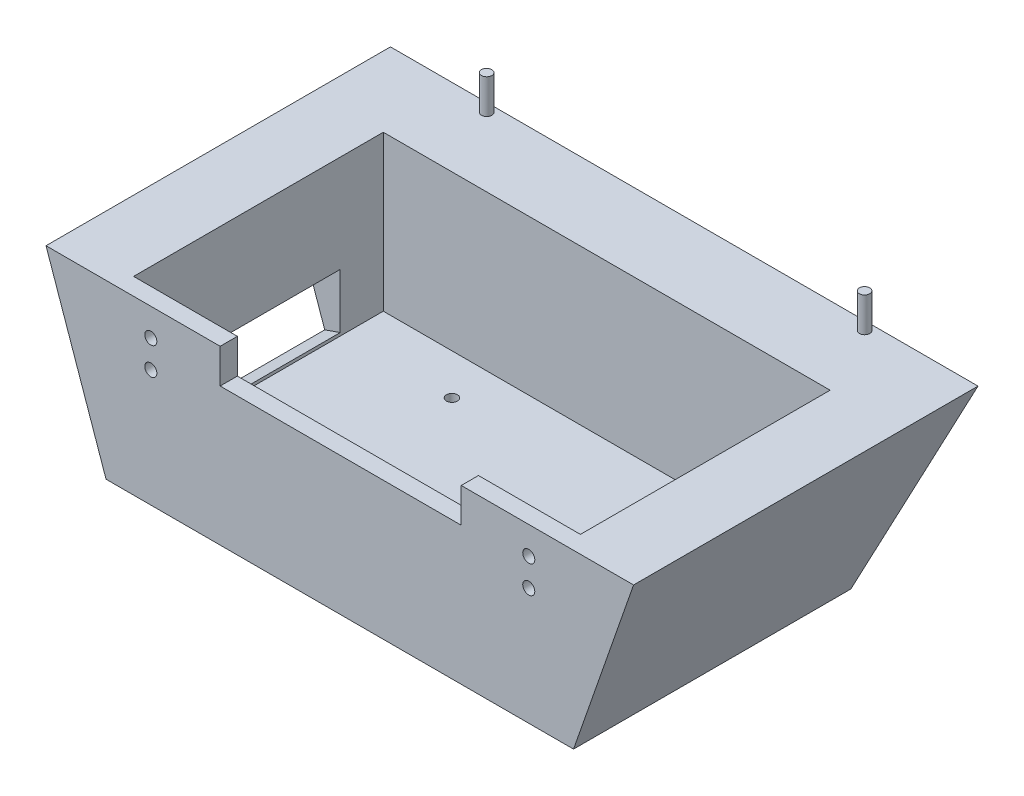
ISO-10303-21;
HEADER;
FILE_DESCRIPTION(('STEP AP214'),'2;1');
FILE_NAME('part.step','',(''),(''),'','','');
FILE_SCHEMA(('AUTOMOTIVE_DESIGN { 1 0 10303 214 1 1 1 1 }'));
ENDSEC;
DATA;
#1=APPLICATION_CONTEXT('core data for automotive mechanical design processes');
#2=APPLICATION_PROTOCOL_DEFINITION('international standard','automotive_design',2000,#1);
#3=PRODUCT_CONTEXT('',#1,'mechanical');
#4=PRODUCT('Part','Part','',(#3));
#5=PRODUCT_RELATED_PRODUCT_CATEGORY('part','',(#4));
#6=PRODUCT_DEFINITION_FORMATION('','',#4);
#7=PRODUCT_DEFINITION_CONTEXT('part definition',#1,'design');
#8=PRODUCT_DEFINITION('design','',#6,#7);
#9=PRODUCT_DEFINITION_SHAPE('','',#8);
#10=(LENGTH_UNIT() NAMED_UNIT(*) SI_UNIT(.MILLI.,.METRE.));
#11=(NAMED_UNIT(*) PLANE_ANGLE_UNIT() SI_UNIT($,.RADIAN.));
#12=(NAMED_UNIT(*) SI_UNIT($,.STERADIAN.) SOLID_ANGLE_UNIT());
#13=UNCERTAINTY_MEASURE_WITH_UNIT(LENGTH_MEASURE(1.E-05),#10,'distance_accuracy_value','');
#14=(GEOMETRIC_REPRESENTATION_CONTEXT(3) GLOBAL_UNCERTAINTY_ASSIGNED_CONTEXT((#13)) GLOBAL_UNIT_ASSIGNED_CONTEXT((#10,
#11,#12)) REPRESENTATION_CONTEXT('',''));
#15=CARTESIAN_POINT('',(0.,0.,0.));
#16=DIRECTION('',(0.,0.,1.));
#17=DIRECTION('',(1.,0.,0.));
#18=AXIS2_PLACEMENT_3D('',#15,#16,#17);
#19=CARTESIAN_POINT('',(-78.83991424,0.,20.464595486949));
#20=DIRECTION('',(-0.944269847347435,-0.329172379446472,0.));
#21=DIRECTION('',(0.329172379446472,-0.944269847347435,0.));
#22=AXIS2_PLACEMENT_3D('',#19,#20,#21);
#23=PLANE('',#22);
#24=DIRECTION('',(0.,0.,1.));
#25=VECTOR('',#24,1.);
#26=CARTESIAN_POINT('',(-80.3432902641756,4.31261168157928,35.964595486949));
#27=LINE('',#26,#25);
#28=CARTESIAN_POINT('',(-80.3432902641756,4.31261168157928,35.964595486949));
#29=VERTEX_POINT('',#28);
#30=CARTESIAN_POINT('',(-80.3432902641756,4.31261168157928,85.964595486949));
#31=VERTEX_POINT('',#30);
#32=EDGE_CURVE('E162',#29,#31,#27,.T.);
#33=ORIENTED_EDGE('',*,*,#32,.F.);
#34=DIRECTION('',(0.329172379446472,-0.944269847347435,0.));
#35=VECTOR('',#34,1.);
#36=CARTESIAN_POINT('',(-85.2808759558727,18.4766593917908,35.964595486949));
#37=LINE('',#36,#35);
#38=CARTESIAN_POINT('',(-85.2808759558727,18.4766593917908,35.964595486949));
#39=VERTEX_POINT('',#38);
#40=EDGE_CURVE('E52',#39,#29,#37,.T.);
#41=ORIENTED_EDGE('',*,*,#40,.F.);
#42=DIRECTION('',(0.,0.,-1.));
#43=VECTOR('',#42,1.);
#44=CARTESIAN_POINT('',(-85.2808759558727,18.4766593917908,85.964595486949));
#45=LINE('',#44,#43);
#46=CARTESIAN_POINT('',(-85.2808759558727,18.4766593917908,85.964595486949));
#47=VERTEX_POINT('',#46);
#48=EDGE_CURVE('E168',#47,#39,#45,.T.);
#49=ORIENTED_EDGE('',*,*,#48,.F.);
#50=DIRECTION('',(-0.329172379446472,0.944269847347435,0.));
#51=VECTOR('',#50,1.);
#52=CARTESIAN_POINT('',(-80.3432902641756,4.31261168157928,85.964595486949));
#53=LINE('',#52,#51);
#54=EDGE_CURVE('E153',#31,#47,#53,.T.);
#55=ORIENTED_EDGE('',*,*,#54,.F.);
#56=EDGE_LOOP('',(#33,#41,#49,#55));
#57=FACE_BOUND('',#56,.T.);
#58=DIRECTION('',(0.,0.,1.));
#59=VECTOR('',#58,1.);
#60=CARTESIAN_POINT('',(-78.83991424,0.,20.464595486949));
#61=LINE('',#60,#59);
#62=CARTESIAN_POINT('',(-78.83991424,0.,20.464595486949));
#63=VERTEX_POINT('',#62);
#64=CARTESIAN_POINT('',(-78.83991424,0.,100.964595486949));
#65=VERTEX_POINT('',#64);
#66=EDGE_CURVE('E287',#63,#65,#61,.T.);
#67=ORIENTED_EDGE('',*,*,#66,.T.);
#68=DIRECTION('',(-0.329172379446472,0.944269847347435,0.));
#69=VECTOR('',#68,1.);
#70=CARTESIAN_POINT('',(-80.3940520024546,4.45822772304774,100.964595486949));
#71=LINE('',#70,#69);
#72=CARTESIAN_POINT('',(-96.269909509422,50.,100.964595486949));
#73=VERTEX_POINT('',#72);
#74=EDGE_CURVE('E308',#73,#65,#71,.F.);
#75=ORIENTED_EDGE('',*,*,#74,.F.);
#76=DIRECTION('',(0.,0.,-1.));
#77=VECTOR('',#76,1.);
#78=CARTESIAN_POINT('',(-96.269909509422,50.,20.464595486949));
#79=LINE('',#78,#77);
#80=CARTESIAN_POINT('',(-96.269909509422,50.,0.964599124302735));
#81=VERTEX_POINT('',#80);
#82=EDGE_CURVE('E302',#81,#73,#79,.F.);
#83=ORIENTED_EDGE('',*,*,#82,.F.);
#84=DIRECTION('',(0.308892253106992,-0.88609390975823,0.345576560344969));
#85=VECTOR('',#84,1.);
#86=CARTESIAN_POINT('',(-78.83991424,0.,20.464595486949));
#87=LINE('',#86,#85);
#88=EDGE_CURVE('E298',#81,#63,#87,.T.);
#89=ORIENTED_EDGE('',*,*,#88,.T.);
#90=EDGE_LOOP('',(#67,#75,#83,#89));
#91=FACE_BOUND('',#90,.T.);
#92=ADVANCED_FACE('F37',(#57,#91),#23,.T.);
#93=CARTESIAN_POINT('',(-78.83991424,5.,100.964595486949));
#94=DIRECTION('',(0.,0.,-1.));
#95=DIRECTION('',(-1.,0.,0.));
#96=AXIS2_PLACEMENT_3D('',#93,#94,#95);
#97=PLANE('',#96);
#98=CARTESIAN_POINT('',(-65.83991424,34.,100.964595486949));
#99=DIRECTION('',(0.,0.,-1.));
#100=DIRECTION('',(-1.,0.,0.));
#101=AXIS2_PLACEMENT_3D('',#98,#99,#100);
#102=CIRCLE('',#101,1.75);
#103=CARTESIAN_POINT('',(-67.58991424,34.,100.964595486949));
#104=VERTEX_POINT('',#103);
#105=EDGE_CURVE('E244',#104,#104,#102,.T.);
#106=ORIENTED_EDGE('',*,*,#105,.T.);
#107=EDGE_LOOP('',(#106));
#108=FACE_BOUND('',#107,.T.);
#109=CARTESIAN_POINT('',(43.89008576,42.,100.964595486949));
#110=DIRECTION('',(0.,0.,-1.));
#111=DIRECTION('',(-1.,0.,0.));
#112=AXIS2_PLACEMENT_3D('',#109,#110,#111);
#113=CIRCLE('',#112,1.75);
#114=CARTESIAN_POINT('',(42.14008576,42.,100.964595486949));
#115=VERTEX_POINT('',#114);
#116=EDGE_CURVE('E241',#115,#115,#113,.T.);
#117=ORIENTED_EDGE('',*,*,#116,.T.);
#118=EDGE_LOOP('',(#117));
#119=FACE_BOUND('',#118,.T.);
#120=CARTESIAN_POINT('',(43.89008576,34.,100.964595486949));
#121=DIRECTION('',(0.,0.,-1.));
#122=DIRECTION('',(-1.,0.,0.));
#123=AXIS2_PLACEMENT_3D('',#120,#121,#122);
#124=CIRCLE('',#123,1.75);
#125=CARTESIAN_POINT('',(42.14008576,34.,100.964595486949));
#126=VERTEX_POINT('',#125);
#127=EDGE_CURVE('E233',#126,#126,#124,.T.);
#128=ORIENTED_EDGE('',*,*,#127,.T.);
#129=EDGE_LOOP('',(#128));
#130=FACE_BOUND('',#129,.T.);
#131=CARTESIAN_POINT('',(-65.83991424,42.,100.964595486949));
#132=DIRECTION('',(0.,0.,-1.));
#133=DIRECTION('',(-1.,0.,0.));
#134=AXIS2_PLACEMENT_3D('',#131,#132,#133);
#135=CIRCLE('',#134,1.75);
#136=CARTESIAN_POINT('',(-67.58991424,42.,100.964595486949));
#137=VERTEX_POINT('',#136);
#138=EDGE_CURVE('E250',#137,#137,#135,.T.);
#139=ORIENTED_EDGE('',*,*,#138,.T.);
#140=EDGE_LOOP('',(#139));
#141=FACE_BOUND('',#140,.T.);
#142=DIRECTION('',(1.,0.,0.));
#143=VECTOR('',#142,1.);
#144=CARTESIAN_POINT('',(-45.70991424,40.,100.964595486949));
#145=LINE('',#144,#143);
#146=CARTESIAN_POINT('',(-45.70991424,40.,100.964595486949));
#147=VERTEX_POINT('',#146);
#148=CARTESIAN_POINT('',(24.29008576,40.,100.964595486949));
#149=VERTEX_POINT('',#148);
#150=EDGE_CURVE('E254',#147,#149,#145,.T.);
#151=ORIENTED_EDGE('',*,*,#150,.F.);
#152=DIRECTION('',(0.,1.,0.));
#153=VECTOR('',#152,1.);
#154=CARTESIAN_POINT('',(-45.70991424,40.,100.964595486949));
#155=LINE('',#154,#153);
#156=CARTESIAN_POINT('',(-45.70991424,50.,100.964595486949));
#157=VERTEX_POINT('',#156);
#158=EDGE_CURVE('E269',#147,#157,#155,.T.);
#159=ORIENTED_EDGE('',*,*,#158,.T.);
#160=DIRECTION('',(1.,0.,0.));
#161=VECTOR('',#160,1.);
#162=CARTESIAN_POINT('',(0.,50.,100.964595486949));
#163=LINE('',#162,#161);
#164=EDGE_CURVE('E284',#73,#157,#163,.T.);
#165=ORIENTED_EDGE('',*,*,#164,.F.);
#166=ORIENTED_EDGE('',*,*,#74,.T.);
#167=DIRECTION('',(1.,0.,0.));
#168=VECTOR('',#167,1.);
#169=CARTESIAN_POINT('',(-78.83991424,0.,100.964595486949));
#170=LINE('',#169,#168);
#171=CARTESIAN_POINT('',(56.89008576,0.,100.964595486949));
#172=VERTEX_POINT('',#171);
#173=EDGE_CURVE('E292',#65,#172,#170,.T.);
#174=ORIENTED_EDGE('',*,*,#173,.T.);
#175=DIRECTION('',(0.329172379446472,0.944269847347435,0.));
#176=VECTOR('',#175,1.);
#177=CARTESIAN_POINT('',(56.89008576,0.,100.964595486949));
#178=LINE('',#177,#176);
#179=CARTESIAN_POINT('',(74.320081029422,50.,100.964595486949));
#180=VERTEX_POINT('',#179);
#181=EDGE_CURVE('E312',#180,#172,#178,.F.);
#182=ORIENTED_EDGE('',*,*,#181,.F.);
#183=CARTESIAN_POINT('',(24.29008576,50.,100.964595486949));
#184=VERTEX_POINT('',#183);
#185=EDGE_CURVE('E288',#184,#180,#163,.T.);
#186=ORIENTED_EDGE('',*,*,#185,.F.);
#187=DIRECTION('',(0.,1.,0.));
#188=VECTOR('',#187,1.);
#189=CARTESIAN_POINT('',(24.29008576,40.,100.964595486949));
#190=LINE('',#189,#188);
#191=EDGE_CURVE('E266',#149,#184,#190,.T.);
#192=ORIENTED_EDGE('',*,*,#191,.F.);
#193=EDGE_LOOP('',(#151,#159,#165,#166,#174,#182,#186,#192));
#194=FACE_BOUND('',#193,.T.);
#195=ADVANCED_FACE('F341',(#108,#119,#130,#141,#194),#97,.F.);
#196=CARTESIAN_POINT('',(56.89008576,0.,20.464595486949));
#197=DIRECTION('',(0.944269847347435,-0.329172379446472,0.));
#198=DIRECTION('',(0.329172379446472,0.944269847347435,0.));
#199=AXIS2_PLACEMENT_3D('',#196,#197,#198);
#200=PLANE('',#199);
#201=DIRECTION('',(0.,0.,-1.));
#202=VECTOR('',#201,1.);
#203=CARTESIAN_POINT('',(56.89008576,0.,20.464595486949));
#204=LINE('',#203,#202);
#205=CARTESIAN_POINT('',(56.89008576,0.,20.464595486949));
#206=VERTEX_POINT('',#205);
#207=EDGE_CURVE('E294',#172,#206,#204,.T.);
#208=ORIENTED_EDGE('',*,*,#207,.T.);
#209=DIRECTION('',(-0.308892253106992,-0.88609390975823,0.345576560344969));
#210=VECTOR('',#209,1.);
#211=CARTESIAN_POINT('',(43.9394859864741,-37.1503249809986,34.953219526961));
#212=LINE('',#211,#210);
#213=CARTESIAN_POINT('',(74.320081029422,50.,0.964599124302735));
#214=VERTEX_POINT('',#213);
#215=EDGE_CURVE('E305',#214,#206,#212,.T.);
#216=ORIENTED_EDGE('',*,*,#215,.F.);
#217=DIRECTION('',(0.,0.,1.));
#218=VECTOR('',#217,1.);
#219=CARTESIAN_POINT('',(74.320081029422,50.,20.464595486949));
#220=LINE('',#219,#218);
#221=EDGE_CURVE('E282',#180,#214,#220,.F.);
#222=ORIENTED_EDGE('',*,*,#221,.F.);
#223=ORIENTED_EDGE('',*,*,#181,.T.);
#224=EDGE_LOOP('',(#208,#216,#222,#223));
#225=FACE_BOUND('',#224,.T.);
#226=ADVANCED_FACE('F39',(#225),#200,.T.);
#227=CARTESIAN_POINT('',(-78.83991424,0.,20.464595486949));
#228=DIRECTION('',(0.,-0.363345217664158,-0.931654578049497));
#229=DIRECTION('',(0.,0.931654578049497,-0.363345217664158));
#230=AXIS2_PLACEMENT_3D('',#227,#228,#229);
#231=PLANE('',#230);
#232=DIRECTION('',(-1.,0.,0.));
#233=VECTOR('',#232,1.);
#234=CARTESIAN_POINT('',(-78.83991424,0.,20.464595486949));
#235=LINE('',#234,#233);
#236=EDGE_CURVE('E296',#206,#63,#235,.T.);
#237=ORIENTED_EDGE('',*,*,#236,.T.);
#238=ORIENTED_EDGE('',*,*,#88,.F.);
#239=DIRECTION('',(1.,0.,0.));
#240=VECTOR('',#239,1.);
#241=CARTESIAN_POINT('',(-78.83991424,50.,0.964599124302735));
#242=LINE('',#241,#240);
#243=EDGE_CURVE('E299',#214,#81,#242,.F.);
#244=ORIENTED_EDGE('',*,*,#243,.F.);
#245=ORIENTED_EDGE('',*,*,#215,.T.);
#246=EDGE_LOOP('',(#237,#238,#244,#245));
#247=FACE_BOUND('',#246,.T.);
#248=ADVANCED_FACE('F348',(#247),#231,.T.);
#249=CARTESIAN_POINT('',(0.,0.,0.));
#250=DIRECTION('',(0.,1.,0.));
#251=DIRECTION('',(0.,0.,1.));
#252=AXIS2_PLACEMENT_3D('',#249,#250,#251);
#253=PLANE('',#252);
#254=CARTESIAN_POINT('',(-44.0699142402002,0.,35.3019980379357));
#255=DIRECTION('',(0.,1.,0.));
#256=DIRECTION('',(0.,0.,1.));
#257=AXIS2_PLACEMENT_3D('',#254,#255,#256);
#258=CIRCLE('',#257,1.6);
#259=CARTESIAN_POINT('',(-44.0699142402002,0.,36.9019980379357));
#260=VERTEX_POINT('',#259);
#261=EDGE_CURVE('E192',#260,#260,#258,.T.);
#262=ORIENTED_EDGE('',*,*,#261,.T.);
#263=EDGE_LOOP('',(#262));
#264=FACE_BOUND('',#263,.T.);
#265=CARTESIAN_POINT('',(30.8600857597998,0.,35.3019980332611));
#266=DIRECTION('',(0.,1.,0.));
#267=DIRECTION('',(0.,0.,1.));
#268=AXIS2_PLACEMENT_3D('',#265,#266,#267);
#269=CIRCLE('',#268,1.6);
#270=CARTESIAN_POINT('',(30.8600857597998,0.,36.9019980332611));
#271=VERTEX_POINT('',#270);
#272=EDGE_CURVE('E189',#271,#271,#269,.T.);
#273=ORIENTED_EDGE('',*,*,#272,.T.);
#274=EDGE_LOOP('',(#273));
#275=FACE_BOUND('',#274,.T.);
#276=CARTESIAN_POINT('',(37.2100857628106,0.,83.5619980328649));
#277=DIRECTION('',(0.,1.,0.));
#278=DIRECTION('',(0.,0.,1.));
#279=AXIS2_PLACEMENT_3D('',#276,#277,#278);
#280=CIRCLE('',#279,1.60000000000001);
#281=CARTESIAN_POINT('',(37.2100857628106,0.,85.1619980328649));
#282=VERTEX_POINT('',#281);
#283=EDGE_CURVE('E181',#282,#282,#280,.T.);
#284=ORIENTED_EDGE('',*,*,#283,.T.);
#285=EDGE_LOOP('',(#284));
#286=FACE_BOUND('',#285,.T.);
#287=CARTESIAN_POINT('',(-45.3399142371894,0.,83.5619980380149));
#288=DIRECTION('',(0.,1.,0.));
#289=DIRECTION('',(0.,0.,1.));
#290=AXIS2_PLACEMENT_3D('',#287,#288,#289);
#291=CIRCLE('',#290,1.6);
#292=CARTESIAN_POINT('',(-45.3399142371894,0.,85.1619980380149));
#293=VERTEX_POINT('',#292);
#294=EDGE_CURVE('E198',#293,#293,#291,.T.);
#295=ORIENTED_EDGE('',*,*,#294,.T.);
#296=EDGE_LOOP('',(#295));
#297=FACE_BOUND('',#296,.T.);
#298=ORIENTED_EDGE('',*,*,#66,.F.);
#299=ORIENTED_EDGE('',*,*,#236,.F.);
#300=ORIENTED_EDGE('',*,*,#207,.F.);
#301=ORIENTED_EDGE('',*,*,#173,.F.);
#302=EDGE_LOOP('',(#298,#299,#300,#301));
#303=FACE_BOUND('',#302,.T.);
#304=ADVANCED_FACE('F350',(#264,#275,#286,#297,#303),#253,.F.);
#305=CARTESIAN_POINT('',(0.,50.,95.964595486949));
#306=DIRECTION('',(0.,0.,1.));
#307=DIRECTION('',(1.,0.,0.));
#308=AXIS2_PLACEMENT_3D('',#305,#306,#307);
#309=PLANE('',#308);
#310=CARTESIAN_POINT('',(-65.83991424,34.,95.964595486949));
#311=DIRECTION('',(0.,0.,-1.));
#312=DIRECTION('',(-1.,0.,0.));
#313=AXIS2_PLACEMENT_3D('',#310,#311,#312);
#314=CIRCLE('',#313,1.75);
#315=CARTESIAN_POINT('',(-67.58991424,34.,95.964595486949));
#316=VERTEX_POINT('',#315);
#317=EDGE_CURVE('E230',#316,#316,#314,.T.);
#318=ORIENTED_EDGE('',*,*,#317,.F.);
#319=EDGE_LOOP('',(#318));
#320=FACE_BOUND('',#319,.T.);
#321=CARTESIAN_POINT('',(43.89008576,42.,95.964595486949));
#322=DIRECTION('',(0.,0.,-1.));
#323=DIRECTION('',(-1.,0.,0.));
#324=AXIS2_PLACEMENT_3D('',#321,#322,#323);
#325=CIRCLE('',#324,1.75);
#326=CARTESIAN_POINT('',(42.14008576,42.,95.964595486949));
#327=VERTEX_POINT('',#326);
#328=EDGE_CURVE('E234',#327,#327,#325,.T.);
#329=ORIENTED_EDGE('',*,*,#328,.F.);
#330=EDGE_LOOP('',(#329));
#331=FACE_BOUND('',#330,.T.);
#332=CARTESIAN_POINT('',(43.89008576,34.,95.964595486949));
#333=DIRECTION('',(0.,0.,-1.));
#334=DIRECTION('',(-1.,0.,0.));
#335=AXIS2_PLACEMENT_3D('',#332,#333,#334);
#336=CIRCLE('',#335,1.75);
#337=CARTESIAN_POINT('',(42.14008576,34.,95.964595486949));
#338=VERTEX_POINT('',#337);
#339=EDGE_CURVE('E223',#338,#338,#336,.T.);
#340=ORIENTED_EDGE('',*,*,#339,.F.);
#341=EDGE_LOOP('',(#340));
#342=FACE_BOUND('',#341,.T.);
#343=CARTESIAN_POINT('',(-65.83991424,42.,95.964595486949));
#344=DIRECTION('',(0.,0.,-1.));
#345=DIRECTION('',(-1.,0.,0.));
#346=AXIS2_PLACEMENT_3D('',#343,#344,#345);
#347=CIRCLE('',#346,1.75);
#348=CARTESIAN_POINT('',(-67.58991424,42.,95.964595486949));
#349=VERTEX_POINT('',#348);
#350=EDGE_CURVE('E247',#349,#349,#347,.T.);
#351=ORIENTED_EDGE('',*,*,#350,.F.);
#352=EDGE_LOOP('',(#351));
#353=FACE_BOUND('',#352,.T.);
#354=DIRECTION('',(-1.,0.,0.));
#355=VECTOR('',#354,1.);
#356=CARTESIAN_POINT('',(0.,50.,95.964595486949));
#357=LINE('',#356,#355);
#358=CARTESIAN_POINT('',(-45.70991424,50.,95.964595486949));
#359=VERTEX_POINT('',#358);
#360=CARTESIAN_POINT('',(-75.83991424,50.,95.964595486949));
#361=VERTEX_POINT('',#360);
#362=EDGE_CURVE('E283',#359,#361,#357,.T.);
#363=ORIENTED_EDGE('',*,*,#362,.F.);
#364=DIRECTION('',(0.,1.,0.));
#365=VECTOR('',#364,1.);
#366=CARTESIAN_POINT('',(-45.70991424,40.,95.964595486949));
#367=LINE('',#366,#365);
#368=CARTESIAN_POINT('',(-45.70991424,40.,95.964595486949));
#369=VERTEX_POINT('',#368);
#370=EDGE_CURVE('E273',#369,#359,#367,.T.);
#371=ORIENTED_EDGE('',*,*,#370,.F.);
#372=DIRECTION('',(-1.,0.,0.));
#373=VECTOR('',#372,1.);
#374=CARTESIAN_POINT('',(-45.70991424,40.,95.964595486949));
#375=LINE('',#374,#373);
#376=CARTESIAN_POINT('',(24.29008576,40.,95.964595486949));
#377=VERTEX_POINT('',#376);
#378=EDGE_CURVE('E261',#377,#369,#375,.T.);
#379=ORIENTED_EDGE('',*,*,#378,.F.);
#380=DIRECTION('',(0.,1.,0.));
#381=VECTOR('',#380,1.);
#382=CARTESIAN_POINT('',(24.29008576,40.,95.964595486949));
#383=LINE('',#382,#381);
#384=CARTESIAN_POINT('',(24.29008576,50.,95.964595486949));
#385=VERTEX_POINT('',#384);
#386=EDGE_CURVE('E275',#377,#385,#383,.T.);
#387=ORIENTED_EDGE('',*,*,#386,.T.);
#388=CARTESIAN_POINT('',(53.89008576,50.,95.964595486949));
#389=VERTEX_POINT('',#388);
#390=EDGE_CURVE('E279',#389,#385,#357,.T.);
#391=ORIENTED_EDGE('',*,*,#390,.F.);
#392=DIRECTION('',(0.,1.,0.));
#393=VECTOR('',#392,1.);
#394=CARTESIAN_POINT('',(53.89008576,5.,95.964595486949));
#395=LINE('',#394,#393);
#396=CARTESIAN_POINT('',(53.89008576,5.,95.964595486949));
#397=VERTEX_POINT('',#396);
#398=EDGE_CURVE('E212',#397,#389,#395,.T.);
#399=ORIENTED_EDGE('',*,*,#398,.F.);
#400=DIRECTION('',(-1.,0.,0.));
#401=VECTOR('',#400,1.);
#402=CARTESIAN_POINT('',(0.,5.,95.964595486949));
#403=LINE('',#402,#401);
#404=CARTESIAN_POINT('',(-75.83991424,5.,95.964595486949));
#405=VERTEX_POINT('',#404);
#406=EDGE_CURVE('E272',#397,#405,#403,.T.);
#407=ORIENTED_EDGE('',*,*,#406,.T.);
#408=DIRECTION('',(0.,1.,0.));
#409=VECTOR('',#408,1.);
#410=CARTESIAN_POINT('',(-75.83991424,5.,95.964595486949));
#411=LINE('',#410,#409);
#412=EDGE_CURVE('E220',#405,#361,#411,.T.);
#413=ORIENTED_EDGE('',*,*,#412,.T.);
#414=EDGE_LOOP('',(#363,#371,#379,#387,#391,#399,#407,#413));
#415=FACE_BOUND('',#414,.T.);
#416=ADVANCED_FACE('F355',(#320,#331,#342,#353,#415),#309,.F.);
#417=CARTESIAN_POINT('',(0.,50.,0.));
#418=DIRECTION('',(0.,1.,0.));
#419=DIRECTION('',(0.,0.,1.));
#420=AXIS2_PLACEMENT_3D('',#417,#418,#419);
#421=PLANE('',#420);
#422=CARTESIAN_POINT('',(43.890085759422,50.,3.46459912430277));
#423=DIRECTION('',(0.,1.,0.));
#424=DIRECTION('',(0.,0.,1.));
#425=AXIS2_PLACEMENT_3D('',#422,#423,#424);
#426=CIRCLE('',#425,1.5);
#427=CARTESIAN_POINT('',(43.890085759422,50.,4.96459912430278));
#428=VERTEX_POINT('',#427);
#429=EDGE_CURVE('E748',#428,#428,#426,.T.);
#430=ORIENTED_EDGE('',*,*,#429,.F.);
#431=EDGE_LOOP('',(#430));
#432=FACE_BOUND('',#431,.T.);
#433=CARTESIAN_POINT('',(-65.839914240578,50.,3.46459912430277));
#434=DIRECTION('',(0.,1.,0.));
#435=DIRECTION('',(0.,0.,1.));
#436=AXIS2_PLACEMENT_3D('',#433,#434,#435);
#437=CIRCLE('',#436,1.5);
#438=CARTESIAN_POINT('',(-65.839914240578,50.,4.96459912430277));
#439=VERTEX_POINT('',#438);
#440=EDGE_CURVE('E747',#439,#439,#437,.T.);
#441=ORIENTED_EDGE('',*,*,#440,.F.);
#442=EDGE_LOOP('',(#441));
#443=FACE_BOUND('',#442,.T.);
#444=ORIENTED_EDGE('',*,*,#362,.T.);
#445=DIRECTION('',(0.,0.,1.));
#446=VECTOR('',#445,1.);
#447=CARTESIAN_POINT('',(-75.83991424,50.,95.964595486949));
#448=LINE('',#447,#446);
#449=CARTESIAN_POINT('',(-75.83991424,50.,23.464595486949));
#450=VERTEX_POINT('',#449);
#451=EDGE_CURVE('E206',#450,#361,#448,.T.);
#452=ORIENTED_EDGE('',*,*,#451,.F.);
#453=DIRECTION('',(-1.,0.,0.));
#454=VECTOR('',#453,1.);
#455=CARTESIAN_POINT('',(-75.83991424,50.,23.464595486949));
#456=LINE('',#455,#454);
#457=CARTESIAN_POINT('',(53.89008576,50.,23.464595486949));
#458=VERTEX_POINT('',#457);
#459=EDGE_CURVE('E215',#458,#450,#456,.T.);
#460=ORIENTED_EDGE('',*,*,#459,.F.);
#461=DIRECTION('',(0.,0.,-1.));
#462=VECTOR('',#461,1.);
#463=CARTESIAN_POINT('',(53.89008576,50.,23.464595486949));
#464=LINE('',#463,#462);
#465=EDGE_CURVE('E201',#389,#458,#464,.T.);
#466=ORIENTED_EDGE('',*,*,#465,.F.);
#467=ORIENTED_EDGE('',*,*,#390,.T.);
#468=DIRECTION('',(0.,0.,-1.));
#469=VECTOR('',#468,1.);
#470=CARTESIAN_POINT('',(24.29008576,50.,100.964595486949));
#471=LINE('',#470,#469);
#472=EDGE_CURVE('E253',#184,#385,#471,.T.);
#473=ORIENTED_EDGE('',*,*,#472,.F.);
#474=ORIENTED_EDGE('',*,*,#185,.T.);
#475=ORIENTED_EDGE('',*,*,#221,.T.);
#476=ORIENTED_EDGE('',*,*,#243,.T.);
#477=ORIENTED_EDGE('',*,*,#82,.T.);
#478=ORIENTED_EDGE('',*,*,#164,.T.);
#479=DIRECTION('',(0.,0.,1.));
#480=VECTOR('',#479,1.);
#481=CARTESIAN_POINT('',(-45.70991424,50.,95.964595486949));
#482=LINE('',#481,#480);
#483=EDGE_CURVE('E258',#359,#157,#482,.T.);
#484=ORIENTED_EDGE('',*,*,#483,.F.);
#485=EDGE_LOOP('',(#444,#452,#460,#466,#467,#473,#474,#475,#476,#477,#478,#484));
#486=FACE_BOUND('',#485,.T.);
#487=ADVANCED_FACE('F361',(#432,#443,#486),#421,.T.);
#488=CARTESIAN_POINT('',(0.,5.,0.));
#489=DIRECTION('',(0.,1.,0.));
#490=DIRECTION('',(0.,0.,1.));
#491=AXIS2_PLACEMENT_3D('',#488,#489,#490);
#492=PLANE('',#491);
#493=CARTESIAN_POINT('',(-44.0699142402002,5.,35.3019980379357));
#494=DIRECTION('',(0.,1.,0.));
#495=DIRECTION('',(0.,0.,1.));
#496=AXIS2_PLACEMENT_3D('',#493,#494,#495);
#497=CIRCLE('',#496,1.6);
#498=CARTESIAN_POINT('',(-44.0699142402002,5.,36.9019980379357));
#499=VERTEX_POINT('',#498);
#500=EDGE_CURVE('E178',#499,#499,#497,.T.);
#501=ORIENTED_EDGE('',*,*,#500,.F.);
#502=EDGE_LOOP('',(#501));
#503=FACE_BOUND('',#502,.T.);
#504=CARTESIAN_POINT('',(30.8600857597998,5.,35.3019980332611));
#505=DIRECTION('',(0.,1.,0.));
#506=DIRECTION('',(0.,0.,1.));
#507=AXIS2_PLACEMENT_3D('',#504,#505,#506);
#508=CIRCLE('',#507,1.6);
#509=CARTESIAN_POINT('',(30.8600857597998,5.,36.9019980332611));
#510=VERTEX_POINT('',#509);
#511=EDGE_CURVE('E182',#510,#510,#508,.T.);
#512=ORIENTED_EDGE('',*,*,#511,.F.);
#513=EDGE_LOOP('',(#512));
#514=FACE_BOUND('',#513,.T.);
#515=CARTESIAN_POINT('',(37.2100857628106,5.,83.5619980328649));
#516=DIRECTION('',(0.,1.,0.));
#517=DIRECTION('',(0.,0.,1.));
#518=AXIS2_PLACEMENT_3D('',#515,#516,#517);
#519=CIRCLE('',#518,1.60000000000001);
#520=CARTESIAN_POINT('',(37.2100857628106,5.,85.1619980328649));
#521=VERTEX_POINT('',#520);
#522=EDGE_CURVE('E175',#521,#521,#519,.T.);
#523=ORIENTED_EDGE('',*,*,#522,.F.);
#524=EDGE_LOOP('',(#523));
#525=FACE_BOUND('',#524,.T.);
#526=CARTESIAN_POINT('',(-45.3399142371894,5.,83.5619980380149));
#527=DIRECTION('',(0.,1.,0.));
#528=DIRECTION('',(0.,0.,1.));
#529=AXIS2_PLACEMENT_3D('',#526,#527,#528);
#530=CIRCLE('',#529,1.6);
#531=CARTESIAN_POINT('',(-45.3399142371894,5.,85.1619980380149));
#532=VERTEX_POINT('',#531);
#533=EDGE_CURVE('E195',#532,#532,#530,.T.);
#534=ORIENTED_EDGE('',*,*,#533,.F.);
#535=EDGE_LOOP('',(#534));
#536=FACE_BOUND('',#535,.T.);
#537=DIRECTION('',(0.,0.,1.));
#538=VECTOR('',#537,1.);
#539=CARTESIAN_POINT('',(-75.83991424,5.,50.577012027892));
#540=LINE('',#539,#538);
#541=CARTESIAN_POINT('',(-75.83991424,5.,23.464595486949));
#542=VERTEX_POINT('',#541);
#543=EDGE_CURVE('E209',#542,#405,#540,.T.);
#544=ORIENTED_EDGE('',*,*,#543,.T.);
#545=ORIENTED_EDGE('',*,*,#406,.F.);
#546=DIRECTION('',(0.,0.,-1.));
#547=VECTOR('',#546,1.);
#548=CARTESIAN_POINT('',(53.89008576,5.,23.464595486949));
#549=LINE('',#548,#547);
#550=CARTESIAN_POINT('',(53.89008576,5.,23.464595486949));
#551=VERTEX_POINT('',#550);
#552=EDGE_CURVE('E202',#397,#551,#549,.T.);
#553=ORIENTED_EDGE('',*,*,#552,.T.);
#554=DIRECTION('',(-1.,0.,0.));
#555=VECTOR('',#554,1.);
#556=CARTESIAN_POINT('',(-75.83991424,5.,23.464595486949));
#557=LINE('',#556,#555);
#558=EDGE_CURVE('E205',#551,#542,#557,.T.);
#559=ORIENTED_EDGE('',*,*,#558,.T.);
#560=EDGE_LOOP('',(#544,#545,#553,#559));
#561=FACE_BOUND('',#560,.T.);
#562=ADVANCED_FACE('F357',(#503,#514,#525,#536,#561),#492,.T.);
#563=CARTESIAN_POINT('',(-45.70991424,40.,95.964595486949));
#564=DIRECTION('',(-1.,0.,0.));
#565=DIRECTION('',(0.,0.,1.));
#566=AXIS2_PLACEMENT_3D('',#563,#564,#565);
#567=PLANE('',#566);
#568=ORIENTED_EDGE('',*,*,#483,.T.);
#569=ORIENTED_EDGE('',*,*,#158,.F.);
#570=DIRECTION('',(0.,0.,1.));
#571=VECTOR('',#570,1.);
#572=CARTESIAN_POINT('',(-45.70991424,40.,95.964595486949));
#573=LINE('',#572,#571);
#574=EDGE_CURVE('E263',#369,#147,#573,.T.);
#575=ORIENTED_EDGE('',*,*,#574,.F.);
#576=ORIENTED_EDGE('',*,*,#370,.T.);
#577=EDGE_LOOP('',(#568,#569,#575,#576));
#578=FACE_BOUND('',#577,.T.);
#579=ADVANCED_FACE('F360',(#578),#567,.F.);
#580=CARTESIAN_POINT('',(24.29008576,40.,100.964595486949));
#581=DIRECTION('',(1.,0.,0.));
#582=DIRECTION('',(0.,0.,-1.));
#583=AXIS2_PLACEMENT_3D('',#580,#581,#582);
#584=PLANE('',#583);
#585=ORIENTED_EDGE('',*,*,#472,.T.);
#586=ORIENTED_EDGE('',*,*,#386,.F.);
#587=DIRECTION('',(0.,0.,-1.));
#588=VECTOR('',#587,1.);
#589=CARTESIAN_POINT('',(24.29008576,40.,100.964595486949));
#590=LINE('',#589,#588);
#591=EDGE_CURVE('E257',#149,#377,#590,.T.);
#592=ORIENTED_EDGE('',*,*,#591,.F.);
#593=ORIENTED_EDGE('',*,*,#191,.T.);
#594=EDGE_LOOP('',(#585,#586,#592,#593));
#595=FACE_BOUND('',#594,.T.);
#596=ADVANCED_FACE('F369',(#595),#584,.F.);
#597=CARTESIAN_POINT('',(0.,40.,0.));
#598=DIRECTION('',(0.,1.,0.));
#599=DIRECTION('',(0.,0.,1.));
#600=AXIS2_PLACEMENT_3D('',#597,#598,#599);
#601=PLANE('',#600);
#602=ORIENTED_EDGE('',*,*,#150,.T.);
#603=ORIENTED_EDGE('',*,*,#591,.T.);
#604=ORIENTED_EDGE('',*,*,#378,.T.);
#605=ORIENTED_EDGE('',*,*,#574,.T.);
#606=EDGE_LOOP('',(#602,#603,#604,#605));
#607=FACE_BOUND('',#606,.T.);
#608=ADVANCED_FACE('F372',(#607),#601,.T.);
#609=CARTESIAN_POINT('',(-65.83991424,42.,105.964595486949));
#610=DIRECTION('',(0.,0.,-1.));
#611=DIRECTION('',(-1.,0.,0.));
#612=AXIS2_PLACEMENT_3D('',#609,#610,#611);
#613=CYLINDRICAL_SURFACE('',#612,1.75);
#614=ORIENTED_EDGE('',*,*,#350,.T.);
#615=EDGE_LOOP('',(#614));
#616=FACE_BOUND('',#615,.T.);
#617=ORIENTED_EDGE('',*,*,#138,.F.);
#618=EDGE_LOOP('',(#617));
#619=FACE_BOUND('',#618,.T.);
#620=ADVANCED_FACE('F379',(#616,#619),#613,.F.);
#621=CARTESIAN_POINT('',(43.89008576,34.,105.964595486949));
#622=DIRECTION('',(0.,0.,-1.));
#623=DIRECTION('',(-1.,0.,0.));
#624=AXIS2_PLACEMENT_3D('',#621,#622,#623);
#625=CYLINDRICAL_SURFACE('',#624,1.75);
#626=ORIENTED_EDGE('',*,*,#339,.T.);
#627=EDGE_LOOP('',(#626));
#628=FACE_BOUND('',#627,.T.);
#629=ORIENTED_EDGE('',*,*,#127,.F.);
#630=EDGE_LOOP('',(#629));
#631=FACE_BOUND('',#630,.T.);
#632=ADVANCED_FACE('F383',(#628,#631),#625,.F.);
#633=CARTESIAN_POINT('',(43.89008576,42.,105.964595486949));
#634=DIRECTION('',(0.,0.,-1.));
#635=DIRECTION('',(-1.,0.,0.));
#636=AXIS2_PLACEMENT_3D('',#633,#634,#635);
#637=CYLINDRICAL_SURFACE('',#636,1.75);
#638=ORIENTED_EDGE('',*,*,#328,.T.);
#639=EDGE_LOOP('',(#638));
#640=FACE_BOUND('',#639,.T.);
#641=ORIENTED_EDGE('',*,*,#116,.F.);
#642=EDGE_LOOP('',(#641));
#643=FACE_BOUND('',#642,.T.);
#644=ADVANCED_FACE('F387',(#640,#643),#637,.F.);
#645=CARTESIAN_POINT('',(-65.83991424,34.,105.964595486949));
#646=DIRECTION('',(0.,0.,-1.));
#647=DIRECTION('',(-1.,0.,0.));
#648=AXIS2_PLACEMENT_3D('',#645,#646,#647);
#649=CYLINDRICAL_SURFACE('',#648,1.75);
#650=ORIENTED_EDGE('',*,*,#317,.T.);
#651=EDGE_LOOP('',(#650));
#652=FACE_BOUND('',#651,.T.);
#653=ORIENTED_EDGE('',*,*,#105,.F.);
#654=EDGE_LOOP('',(#653));
#655=FACE_BOUND('',#654,.T.);
#656=ADVANCED_FACE('F391',(#652,#655),#649,.F.);
#657=CARTESIAN_POINT('',(-75.83991424,5.,95.964595486949));
#658=DIRECTION('',(-1.,0.,0.));
#659=DIRECTION('',(0.,0.,1.));
#660=AXIS2_PLACEMENT_3D('',#657,#658,#659);
#661=PLANE('',#660);
#662=DIRECTION('',(0.,0.,-1.));
#663=VECTOR('',#662,1.);
#664=CARTESIAN_POINT('',(-75.83991424,21.7677777527199,95.964595486949));
#665=LINE('',#664,#663);
#666=CARTESIAN_POINT('',(-75.83991424,21.7677777527199,85.964595486949));
#667=VERTEX_POINT('',#666);
#668=CARTESIAN_POINT('',(-75.83991424,21.7677777527199,35.964595486949));
#669=VERTEX_POINT('',#668);
#670=EDGE_CURVE('E45',#667,#669,#665,.T.);
#671=ORIENTED_EDGE('',*,*,#670,.T.);
#672=DIRECTION('',(0.,-1.,0.));
#673=VECTOR('',#672,1.);
#674=CARTESIAN_POINT('',(-75.83991424,5.,35.964595486949));
#675=LINE('',#674,#673);
#676=CARTESIAN_POINT('',(-75.83991424,5.88248813753547,35.964595486949));
#677=VERTEX_POINT('',#676);
#678=EDGE_CURVE('E11',#669,#677,#675,.T.);
#679=ORIENTED_EDGE('',*,*,#678,.T.);
#680=DIRECTION('',(0.,0.,1.));
#681=VECTOR('',#680,1.);
#682=CARTESIAN_POINT('',(-75.83991424,5.88248813753547,95.964595486949));
#683=LINE('',#682,#681);
#684=CARTESIAN_POINT('',(-75.83991424,5.88248813753547,85.964595486949));
#685=VERTEX_POINT('',#684);
#686=EDGE_CURVE('E311',#677,#685,#683,.T.);
#687=ORIENTED_EDGE('',*,*,#686,.T.);
#688=DIRECTION('',(0.,1.,0.));
#689=VECTOR('',#688,1.);
#690=CARTESIAN_POINT('',(-75.83991424,5.,85.964595486949));
#691=LINE('',#690,#689);
#692=EDGE_CURVE('E156',#685,#667,#691,.T.);
#693=ORIENTED_EDGE('',*,*,#692,.T.);
#694=EDGE_LOOP('',(#671,#679,#687,#693));
#695=FACE_BOUND('',#694,.T.);
#696=ORIENTED_EDGE('',*,*,#451,.T.);
#697=ORIENTED_EDGE('',*,*,#412,.F.);
#698=ORIENTED_EDGE('',*,*,#543,.F.);
#699=DIRECTION('',(0.,1.,0.));
#700=VECTOR('',#699,1.);
#701=CARTESIAN_POINT('',(-75.83991424,5.,23.464595486949));
#702=LINE('',#701,#700);
#703=EDGE_CURVE('E224',#542,#450,#702,.T.);
#704=ORIENTED_EDGE('',*,*,#703,.T.);
#705=EDGE_LOOP('',(#696,#697,#698,#704));
#706=FACE_BOUND('',#705,.T.);
#707=ADVANCED_FACE('F322',(#695,#706),#661,.F.);
#708=CARTESIAN_POINT('',(-75.83991424,5.,23.464595486949));
#709=DIRECTION('',(0.,0.,-1.));
#710=DIRECTION('',(-1.,0.,0.));
#711=AXIS2_PLACEMENT_3D('',#708,#709,#710);
#712=PLANE('',#711);
#713=ORIENTED_EDGE('',*,*,#459,.T.);
#714=ORIENTED_EDGE('',*,*,#703,.F.);
#715=ORIENTED_EDGE('',*,*,#558,.F.);
#716=DIRECTION('',(0.,1.,0.));
#717=VECTOR('',#716,1.);
#718=CARTESIAN_POINT('',(53.89008576,5.,23.464595486949));
#719=LINE('',#718,#717);
#720=EDGE_CURVE('E226',#551,#458,#719,.T.);
#721=ORIENTED_EDGE('',*,*,#720,.T.);
#722=EDGE_LOOP('',(#713,#714,#715,#721));
#723=FACE_BOUND('',#722,.T.);
#724=ADVANCED_FACE('F400',(#723),#712,.F.);
#725=CARTESIAN_POINT('',(53.89008576,5.,23.464595486949));
#726=DIRECTION('',(1.,0.,0.));
#727=DIRECTION('',(0.,0.,-1.));
#728=AXIS2_PLACEMENT_3D('',#725,#726,#727);
#729=PLANE('',#728);
#730=ORIENTED_EDGE('',*,*,#465,.T.);
#731=ORIENTED_EDGE('',*,*,#720,.F.);
#732=ORIENTED_EDGE('',*,*,#552,.F.);
#733=ORIENTED_EDGE('',*,*,#398,.T.);
#734=EDGE_LOOP('',(#730,#731,#732,#733));
#735=FACE_BOUND('',#734,.T.);
#736=ADVANCED_FACE('F396',(#735),#729,.F.);
#737=CARTESIAN_POINT('',(-45.3399142371894,-5.,83.5619980380149));
#738=DIRECTION('',(0.,1.,0.));
#739=DIRECTION('',(0.,0.,1.));
#740=AXIS2_PLACEMENT_3D('',#737,#738,#739);
#741=CYLINDRICAL_SURFACE('',#740,1.6);
#742=ORIENTED_EDGE('',*,*,#533,.T.);
#743=EDGE_LOOP('',(#742));
#744=FACE_BOUND('',#743,.T.);
#745=ORIENTED_EDGE('',*,*,#294,.F.);
#746=EDGE_LOOP('',(#745));
#747=FACE_BOUND('',#746,.T.);
#748=ADVANCED_FACE('F399',(#744,#747),#741,.F.);
#749=CARTESIAN_POINT('',(37.2100857628106,-5.,83.5619980328649));
#750=DIRECTION('',(0.,1.,0.));
#751=DIRECTION('',(0.,0.,1.));
#752=AXIS2_PLACEMENT_3D('',#749,#750,#751);
#753=CYLINDRICAL_SURFACE('',#752,1.60000000000001);
#754=ORIENTED_EDGE('',*,*,#522,.T.);
#755=EDGE_LOOP('',(#754));
#756=FACE_BOUND('',#755,.T.);
#757=ORIENTED_EDGE('',*,*,#283,.F.);
#758=EDGE_LOOP('',(#757));
#759=FACE_BOUND('',#758,.T.);
#760=ADVANCED_FACE('F409',(#756,#759),#753,.F.);
#761=CARTESIAN_POINT('',(30.8600857597998,-5.,35.3019980332611));
#762=DIRECTION('',(0.,1.,0.));
#763=DIRECTION('',(0.,0.,1.));
#764=AXIS2_PLACEMENT_3D('',#761,#762,#763);
#765=CYLINDRICAL_SURFACE('',#764,1.6);
#766=ORIENTED_EDGE('',*,*,#511,.T.);
#767=EDGE_LOOP('',(#766));
#768=FACE_BOUND('',#767,.T.);
#769=ORIENTED_EDGE('',*,*,#272,.F.);
#770=EDGE_LOOP('',(#769));
#771=FACE_BOUND('',#770,.T.);
#772=ADVANCED_FACE('F336',(#768,#771),#765,.F.);
#773=CARTESIAN_POINT('',(-44.0699142402002,-5.,35.3019980379357));
#774=DIRECTION('',(0.,1.,0.));
#775=DIRECTION('',(0.,0.,1.));
#776=AXIS2_PLACEMENT_3D('',#773,#774,#775);
#777=CYLINDRICAL_SURFACE('',#776,1.6);
#778=ORIENTED_EDGE('',*,*,#500,.T.);
#779=EDGE_LOOP('',(#778));
#780=FACE_BOUND('',#779,.T.);
#781=ORIENTED_EDGE('',*,*,#261,.F.);
#782=EDGE_LOOP('',(#781));
#783=FACE_BOUND('',#782,.T.);
#784=ADVANCED_FACE('F329',(#780,#783),#777,.F.);
#785=CARTESIAN_POINT('',(-71.1168282456612,23.4142450834879,35.964595486949));
#786=DIRECTION('',(0.,0.,-1.));
#787=DIRECTION('',(-1.,0.,0.));
#788=AXIS2_PLACEMENT_3D('',#785,#786,#787);
#789=PLANE('',#788);
#790=DIRECTION('',(-0.944269847347435,-0.329172379446472,0.));
#791=VECTOR('',#790,1.);
#792=CARTESIAN_POINT('',(-71.1168282456612,23.4142450834879,35.964595486949));
#793=LINE('',#792,#791);
#794=EDGE_CURVE('E173',#669,#39,#793,.T.);
#795=ORIENTED_EDGE('',*,*,#794,.T.);
#796=ORIENTED_EDGE('',*,*,#40,.T.);
#797=DIRECTION('',(-0.944269847347435,-0.329172379446472,0.));
#798=VECTOR('',#797,1.);
#799=CARTESIAN_POINT('',(-66.1792425539641,9.25019737327636,35.964595486949));
#800=LINE('',#799,#798);
#801=EDGE_CURVE('E159',#677,#29,#800,.T.);
#802=ORIENTED_EDGE('',*,*,#801,.F.);
#803=ORIENTED_EDGE('',*,*,#678,.F.);
#804=EDGE_LOOP('',(#795,#796,#802,#803));
#805=FACE_BOUND('',#804,.T.);
#806=ADVANCED_FACE('F327',(#805),#789,.F.);
#807=CARTESIAN_POINT('',(-71.1168282456612,23.4142450834879,85.964595486949));
#808=DIRECTION('',(-0.329172379446472,0.944269847347435,0.));
#809=DIRECTION('',(-0.944269847347435,-0.329172379446472,0.));
#810=AXIS2_PLACEMENT_3D('',#807,#808,#809);
#811=PLANE('',#810);
#812=DIRECTION('',(-0.944269847347435,-0.329172379446472,0.));
#813=VECTOR('',#812,1.);
#814=CARTESIAN_POINT('',(-71.1168282456612,23.4142450834879,85.964595486949));
#815=LINE('',#814,#813);
#816=EDGE_CURVE('E158',#667,#47,#815,.T.);
#817=ORIENTED_EDGE('',*,*,#816,.T.);
#818=ORIENTED_EDGE('',*,*,#48,.T.);
#819=ORIENTED_EDGE('',*,*,#794,.F.);
#820=ORIENTED_EDGE('',*,*,#670,.F.);
#821=EDGE_LOOP('',(#817,#818,#819,#820));
#822=FACE_BOUND('',#821,.T.);
#823=ADVANCED_FACE('F326',(#822),#811,.F.);
#824=CARTESIAN_POINT('',(-66.1792425539641,9.25019737327636,85.964595486949));
#825=DIRECTION('',(0.,0.,1.));
#826=DIRECTION('',(1.,0.,0.));
#827=AXIS2_PLACEMENT_3D('',#824,#825,#826);
#828=PLANE('',#827);
#829=DIRECTION('',(-0.944269847347435,-0.329172379446472,0.));
#830=VECTOR('',#829,1.);
#831=CARTESIAN_POINT('',(-66.1792425539641,9.25019737327636,85.964595486949));
#832=LINE('',#831,#830);
#833=EDGE_CURVE('E60',#685,#31,#832,.T.);
#834=ORIENTED_EDGE('',*,*,#833,.T.);
#835=ORIENTED_EDGE('',*,*,#54,.T.);
#836=ORIENTED_EDGE('',*,*,#816,.F.);
#837=ORIENTED_EDGE('',*,*,#692,.F.);
#838=EDGE_LOOP('',(#834,#835,#836,#837));
#839=FACE_BOUND('',#838,.T.);
#840=ADVANCED_FACE('F150',(#839),#828,.F.);
#841=CARTESIAN_POINT('',(-66.1792425539641,9.25019737327636,35.964595486949));
#842=DIRECTION('',(0.329172379446472,-0.944269847347435,0.));
#843=DIRECTION('',(0.944269847347435,0.329172379446472,0.));
#844=AXIS2_PLACEMENT_3D('',#841,#842,#843);
#845=PLANE('',#844);
#846=ORIENTED_EDGE('',*,*,#801,.T.);
#847=ORIENTED_EDGE('',*,*,#32,.T.);
#848=ORIENTED_EDGE('',*,*,#833,.F.);
#849=ORIENTED_EDGE('',*,*,#686,.F.);
#850=EDGE_LOOP('',(#846,#847,#848,#849));
#851=FACE_BOUND('',#850,.T.);
#852=ADVANCED_FACE('F163',(#851),#845,.F.);
#853=CARTESIAN_POINT('',(-65.839914240578,60.,3.46459912430277));
#854=DIRECTION('',(0.,-1.,0.));
#855=DIRECTION('',(0.,0.,-1.));
#856=AXIS2_PLACEMENT_3D('',#853,#854,#855);
#857=CYLINDRICAL_SURFACE('',#856,1.5);
#858=CARTESIAN_POINT('',(-65.839914240578,60.,3.46459912430277));
#859=DIRECTION('',(0.,1.,0.));
#860=DIRECTION('',(0.,0.,1.));
#861=AXIS2_PLACEMENT_3D('',#858,#859,#860);
#862=CIRCLE('',#861,1.5);
#863=CARTESIAN_POINT('',(-65.839914240578,60.,4.96459912430277));
#864=VERTEX_POINT('',#863);
#865=EDGE_CURVE('E751',#864,#864,#862,.T.);
#866=ORIENTED_EDGE('',*,*,#865,.F.);
#867=EDGE_LOOP('',(#866));
#868=FACE_BOUND('',#867,.T.);
#869=ORIENTED_EDGE('',*,*,#440,.T.);
#870=EDGE_LOOP('',(#869));
#871=FACE_BOUND('',#870,.T.);
#872=ADVANCED_FACE('F702',(#868,#871),#857,.T.);
#873=CARTESIAN_POINT('',(-65.839914240578,60.,3.46459912430277));
#874=DIRECTION('',(0.,1.,0.));
#875=DIRECTION('',(0.,0.,1.));
#876=AXIS2_PLACEMENT_3D('',#873,#874,#875);
#877=PLANE('',#876);
#878=ORIENTED_EDGE('',*,*,#865,.T.);
#879=EDGE_LOOP('',(#878));
#880=FACE_BOUND('',#879,.T.);
#881=ADVANCED_FACE('F708',(#880),#877,.T.);
#882=CARTESIAN_POINT('',(43.890085759422,60.,3.46459912430277));
#883=DIRECTION('',(0.,-1.,0.));
#884=DIRECTION('',(0.,0.,-1.));
#885=AXIS2_PLACEMENT_3D('',#882,#883,#884);
#886=CYLINDRICAL_SURFACE('',#885,1.5);
#887=CARTESIAN_POINT('',(43.890085759422,60.,3.46459912430277));
#888=DIRECTION('',(0.,1.,0.));
#889=DIRECTION('',(0.,0.,1.));
#890=AXIS2_PLACEMENT_3D('',#887,#888,#889);
#891=CIRCLE('',#890,1.5);
#892=CARTESIAN_POINT('',(43.890085759422,60.,4.96459912430278));
#893=VERTEX_POINT('',#892);
#894=EDGE_CURVE('E746',#893,#893,#891,.T.);
#895=ORIENTED_EDGE('',*,*,#894,.F.);
#896=EDGE_LOOP('',(#895));
#897=FACE_BOUND('',#896,.T.);
#898=ORIENTED_EDGE('',*,*,#429,.T.);
#899=EDGE_LOOP('',(#898));
#900=FACE_BOUND('',#899,.T.);
#901=ADVANCED_FACE('F717',(#897,#900),#886,.T.);
#902=CARTESIAN_POINT('',(43.890085759422,60.,3.46459912430277));
#903=DIRECTION('',(0.,1.,0.));
#904=DIRECTION('',(0.,0.,1.));
#905=AXIS2_PLACEMENT_3D('',#902,#903,#904);
#906=PLANE('',#905);
#907=ORIENTED_EDGE('',*,*,#894,.T.);
#908=EDGE_LOOP('',(#907));
#909=FACE_BOUND('',#908,.T.);
#910=ADVANCED_FACE('F726',(#909),#906,.T.);
#911=CLOSED_SHELL('',(#92,#195,#226,#248,#304,#416,#487,#562,#579,#596,#608,#620,#632,#644,#656,
#707,#724,#736,#748,#760,#772,#784,#806,#823,#840,#852,#872,#881,#901,#910));
#912=MANIFOLD_SOLID_BREP('B2',#911);
#913=ADVANCED_BREP_SHAPE_REPRESENTATION('',(#18,#912),#14);
#914=SHAPE_DEFINITION_REPRESENTATION(#9,#913);
ENDSEC;
END-ISO-10303-21;
